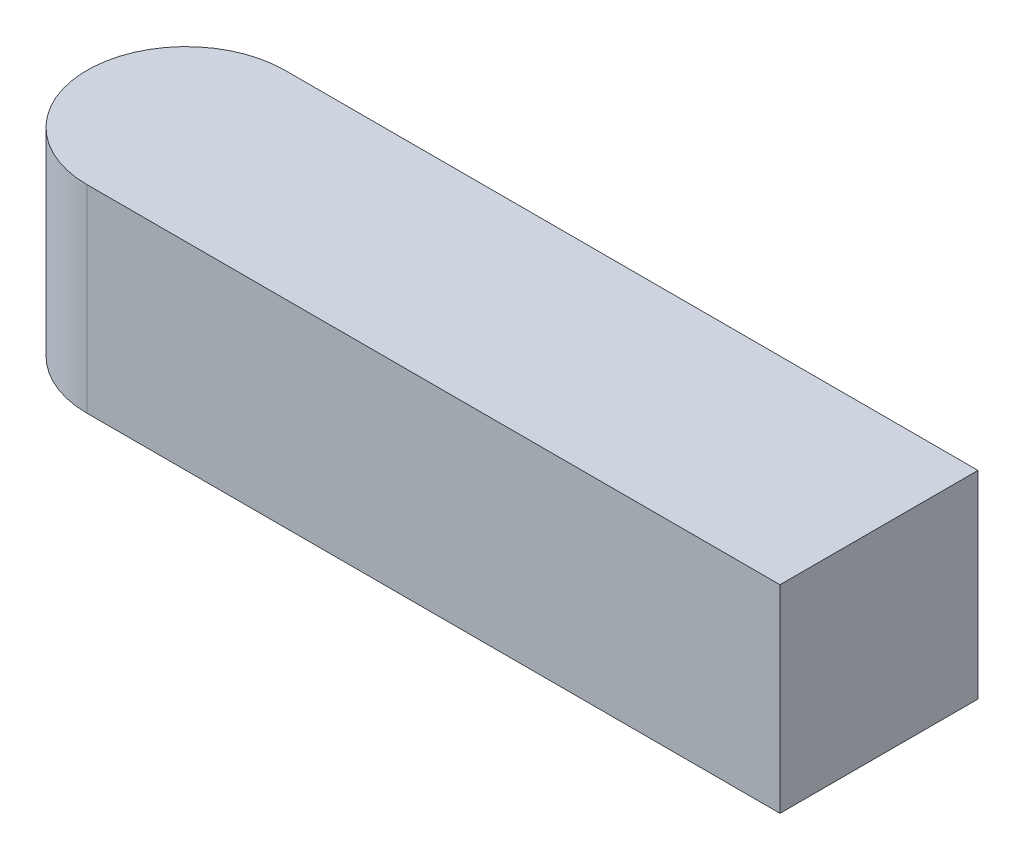
ISO-10303-21;
HEADER;
FILE_DESCRIPTION(('STEP AP214'),'2;1');
FILE_NAME('part.step','',(''),(''),'','','');
FILE_SCHEMA(('AUTOMOTIVE_DESIGN { 1 0 10303 214 1 1 1 1 }'));
ENDSEC;
DATA;
#1=APPLICATION_CONTEXT('core data for automotive mechanical design processes');
#2=APPLICATION_PROTOCOL_DEFINITION('international standard','automotive_design',2000,#1);
#3=PRODUCT_CONTEXT('',#1,'mechanical');
#4=PRODUCT('Part','Part','',(#3));
#5=PRODUCT_RELATED_PRODUCT_CATEGORY('part','',(#4));
#6=PRODUCT_DEFINITION_FORMATION('','',#4);
#7=PRODUCT_DEFINITION_CONTEXT('part definition',#1,'design');
#8=PRODUCT_DEFINITION('design','',#6,#7);
#9=PRODUCT_DEFINITION_SHAPE('','',#8);
#10=(LENGTH_UNIT() NAMED_UNIT(*) SI_UNIT(.MILLI.,.METRE.));
#11=(NAMED_UNIT(*) PLANE_ANGLE_UNIT() SI_UNIT($,.RADIAN.));
#12=(NAMED_UNIT(*) SI_UNIT($,.STERADIAN.) SOLID_ANGLE_UNIT());
#13=UNCERTAINTY_MEASURE_WITH_UNIT(LENGTH_MEASURE(1.E-05),#10,'distance_accuracy_value','');
#14=(GEOMETRIC_REPRESENTATION_CONTEXT(3) GLOBAL_UNCERTAINTY_ASSIGNED_CONTEXT((#13)) GLOBAL_UNIT_ASSIGNED_CONTEXT((#10,
#11,#12)) REPRESENTATION_CONTEXT('',''));
#15=CARTESIAN_POINT('',(0.,0.,0.));
#16=DIRECTION('',(0.,0.,1.));
#17=DIRECTION('',(1.,0.,0.));
#18=AXIS2_PLACEMENT_3D('',#15,#16,#17);
#19=CARTESIAN_POINT('',(-70.,20.,0.));
#20=DIRECTION('',(0.,-1.,0.));
#21=DIRECTION('',(0.,0.,-1.));
#22=AXIS2_PLACEMENT_3D('',#19,#20,#21);
#23=CYLINDRICAL_SURFACE('',#22,10.);
#24=CARTESIAN_POINT('',(-70.,0.,0.));
#25=DIRECTION('',(0.,1.,0.));
#26=DIRECTION('',(0.,0.,1.));
#27=AXIS2_PLACEMENT_3D('',#24,#25,#26);
#28=CIRCLE('',#27,10.);
#29=CARTESIAN_POINT('',(-70.,0.,-10.));
#30=VERTEX_POINT('',#29);
#31=CARTESIAN_POINT('',(-70.,0.,10.));
#32=VERTEX_POINT('',#31);
#33=EDGE_CURVE('E86',#30,#32,#28,.T.);
#34=ORIENTED_EDGE('',*,*,#33,.T.);
#35=DIRECTION('',(0.,-1.,0.));
#36=VECTOR('',#35,1.);
#37=CARTESIAN_POINT('',(-70.,20.,10.));
#38=LINE('',#37,#36);
#39=CARTESIAN_POINT('',(-70.,20.,10.));
#40=VERTEX_POINT('',#39);
#41=EDGE_CURVE('E11',#40,#32,#38,.T.);
#42=ORIENTED_EDGE('',*,*,#41,.F.);
#43=CARTESIAN_POINT('',(-70.,20.,0.));
#44=DIRECTION('',(0.,1.,0.));
#45=DIRECTION('',(0.,0.,1.));
#46=AXIS2_PLACEMENT_3D('',#43,#44,#45);
#47=CIRCLE('',#46,10.);
#48=CARTESIAN_POINT('',(-70.,20.,-10.));
#49=VERTEX_POINT('',#48);
#50=EDGE_CURVE('E85',#49,#40,#47,.T.);
#51=ORIENTED_EDGE('',*,*,#50,.F.);
#52=DIRECTION('',(0.,-1.,0.));
#53=VECTOR('',#52,1.);
#54=CARTESIAN_POINT('',(-70.,20.,-10.));
#55=LINE('',#54,#53);
#56=EDGE_CURVE('E42',#49,#30,#55,.T.);
#57=ORIENTED_EDGE('',*,*,#56,.T.);
#58=EDGE_LOOP('',(#34,#42,#51,#57));
#59=FACE_BOUND('',#58,.T.);
#60=ADVANCED_FACE('F40',(#59),#23,.T.);
#61=CARTESIAN_POINT('',(-70.,20.,10.));
#62=DIRECTION('',(0.,0.,-1.));
#63=DIRECTION('',(-1.,0.,0.));
#64=AXIS2_PLACEMENT_3D('',#61,#62,#63);
#65=PLANE('',#64);
#66=DIRECTION('',(1.,0.,0.));
#67=VECTOR('',#66,1.);
#68=CARTESIAN_POINT('',(-70.,0.,10.));
#69=LINE('',#68,#67);
#70=CARTESIAN_POINT('',(0.,0.,10.));
#71=VERTEX_POINT('',#70);
#72=EDGE_CURVE('E84',#32,#71,#69,.T.);
#73=ORIENTED_EDGE('',*,*,#72,.T.);
#74=DIRECTION('',(0.,1.,0.));
#75=VECTOR('',#74,1.);
#76=CARTESIAN_POINT('',(0.,0.,10.));
#77=LINE('',#76,#75);
#78=CARTESIAN_POINT('',(0.,20.,10.));
#79=VERTEX_POINT('',#78);
#80=EDGE_CURVE('E51',#71,#79,#77,.T.);
#81=ORIENTED_EDGE('',*,*,#80,.T.);
#82=DIRECTION('',(1.,0.,0.));
#83=VECTOR('',#82,1.);
#84=CARTESIAN_POINT('',(-70.,20.,10.));
#85=LINE('',#84,#83);
#86=EDGE_CURVE('E96',#40,#79,#85,.T.);
#87=ORIENTED_EDGE('',*,*,#86,.F.);
#88=ORIENTED_EDGE('',*,*,#41,.T.);
#89=EDGE_LOOP('',(#73,#81,#87,#88));
#90=FACE_BOUND('',#89,.T.);
#91=ADVANCED_FACE('F104',(#90),#65,.F.);
#92=CARTESIAN_POINT('',(-70.,20.,-10.));
#93=DIRECTION('',(0.,0.,1.));
#94=DIRECTION('',(1.,0.,0.));
#95=AXIS2_PLACEMENT_3D('',#92,#93,#94);
#96=PLANE('',#95);
#97=DIRECTION('',(-1.,0.,0.));
#98=VECTOR('',#97,1.);
#99=CARTESIAN_POINT('',(-70.,20.,-10.));
#100=LINE('',#99,#98);
#101=CARTESIAN_POINT('',(0.,20.,-10.));
#102=VERTEX_POINT('',#101);
#103=EDGE_CURVE('E58',#102,#49,#100,.T.);
#104=ORIENTED_EDGE('',*,*,#103,.F.);
#105=DIRECTION('',(0.,1.,0.));
#106=VECTOR('',#105,1.);
#107=CARTESIAN_POINT('',(0.,0.,-10.));
#108=LINE('',#107,#106);
#109=CARTESIAN_POINT('',(0.,0.,-10.));
#110=VERTEX_POINT('',#109);
#111=EDGE_CURVE('E78',#110,#102,#108,.T.);
#112=ORIENTED_EDGE('',*,*,#111,.F.);
#113=DIRECTION('',(-1.,0.,0.));
#114=VECTOR('',#113,1.);
#115=CARTESIAN_POINT('',(-70.,0.,-10.));
#116=LINE('',#115,#114);
#117=EDGE_CURVE('E74',#110,#30,#116,.T.);
#118=ORIENTED_EDGE('',*,*,#117,.T.);
#119=ORIENTED_EDGE('',*,*,#56,.F.);
#120=EDGE_LOOP('',(#104,#112,#118,#119));
#121=FACE_BOUND('',#120,.T.);
#122=ADVANCED_FACE('F79',(#121),#96,.F.);
#123=CARTESIAN_POINT('',(-70.,20.,0.));
#124=DIRECTION('',(0.,1.,0.));
#125=DIRECTION('',(0.,0.,1.));
#126=AXIS2_PLACEMENT_3D('',#123,#124,#125);
#127=PLANE('',#126);
#128=DIRECTION('',(0.,0.,1.));
#129=VECTOR('',#128,1.);
#130=CARTESIAN_POINT('',(0.,20.,-10.));
#131=LINE('',#130,#129);
#132=EDGE_CURVE('E105',#102,#79,#131,.T.);
#133=ORIENTED_EDGE('',*,*,#132,.F.);
#134=ORIENTED_EDGE('',*,*,#103,.T.);
#135=ORIENTED_EDGE('',*,*,#50,.T.);
#136=ORIENTED_EDGE('',*,*,#86,.T.);
#137=EDGE_LOOP('',(#133,#134,#135,#136));
#138=FACE_BOUND('',#137,.T.);
#139=ADVANCED_FACE('F110',(#138),#127,.T.);
#140=CARTESIAN_POINT('',(-70.,0.,0.));
#141=DIRECTION('',(0.,1.,0.));
#142=DIRECTION('',(0.,0.,1.));
#143=AXIS2_PLACEMENT_3D('',#140,#141,#142);
#144=PLANE('',#143);
#145=ORIENTED_EDGE('',*,*,#117,.F.);
#146=DIRECTION('',(0.,0.,1.));
#147=VECTOR('',#146,1.);
#148=CARTESIAN_POINT('',(0.,0.,-10.));
#149=LINE('',#148,#147);
#150=EDGE_CURVE('E99',#110,#71,#149,.T.);
#151=ORIENTED_EDGE('',*,*,#150,.T.);
#152=ORIENTED_EDGE('',*,*,#72,.F.);
#153=ORIENTED_EDGE('',*,*,#33,.F.);
#154=EDGE_LOOP('',(#145,#151,#152,#153));
#155=FACE_BOUND('',#154,.T.);
#156=ADVANCED_FACE('F90',(#155),#144,.F.);
#157=CARTESIAN_POINT('',(0.,0.,-10.));
#158=DIRECTION('',(-1.,0.,0.));
#159=DIRECTION('',(0.,0.,1.));
#160=AXIS2_PLACEMENT_3D('',#157,#158,#159);
#161=PLANE('',#160);
#162=ORIENTED_EDGE('',*,*,#132,.T.);
#163=ORIENTED_EDGE('',*,*,#80,.F.);
#164=ORIENTED_EDGE('',*,*,#150,.F.);
#165=ORIENTED_EDGE('',*,*,#111,.T.);
#166=EDGE_LOOP('',(#162,#163,#164,#165));
#167=FACE_BOUND('',#166,.T.);
#168=ADVANCED_FACE('F113',(#167),#161,.F.);
#169=CLOSED_SHELL('',(#60,#91,#122,#139,#156,#168));
#170=MANIFOLD_SOLID_BREP('B2',#169);
#171=ADVANCED_BREP_SHAPE_REPRESENTATION('',(#18,#170),#14);
#172=SHAPE_DEFINITION_REPRESENTATION(#9,#171);
ENDSEC;
END-ISO-10303-21;
